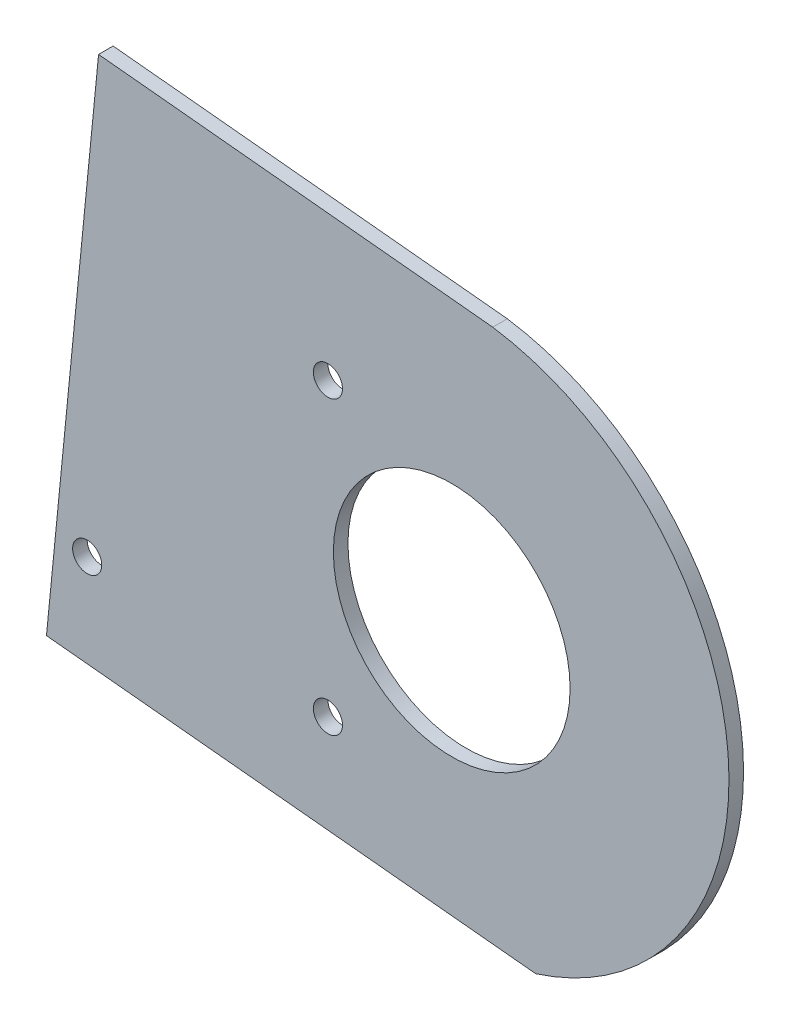
ISO-10303-21;
HEADER;
FILE_DESCRIPTION(('STEP AP214'),'2;1');
FILE_NAME('part.step','',(''),(''),'','','');
FILE_SCHEMA(('AUTOMOTIVE_DESIGN { 1 0 10303 214 1 1 1 1 }'));
ENDSEC;
DATA;
#1=APPLICATION_CONTEXT('core data for automotive mechanical design processes');
#2=APPLICATION_PROTOCOL_DEFINITION('international standard','automotive_design',2000,#1);
#3=PRODUCT_CONTEXT('',#1,'mechanical');
#4=PRODUCT('Part','Part','',(#3));
#5=PRODUCT_RELATED_PRODUCT_CATEGORY('part','',(#4));
#6=PRODUCT_DEFINITION_FORMATION('','',#4);
#7=PRODUCT_DEFINITION_CONTEXT('part definition',#1,'design');
#8=PRODUCT_DEFINITION('design','',#6,#7);
#9=PRODUCT_DEFINITION_SHAPE('','',#8);
#10=(LENGTH_UNIT() NAMED_UNIT(*) SI_UNIT(.MILLI.,.METRE.));
#11=(NAMED_UNIT(*) PLANE_ANGLE_UNIT() SI_UNIT($,.RADIAN.));
#12=(NAMED_UNIT(*) SI_UNIT($,.STERADIAN.) SOLID_ANGLE_UNIT());
#13=UNCERTAINTY_MEASURE_WITH_UNIT(LENGTH_MEASURE(1.E-05),#10,'distance_accuracy_value','');
#14=(GEOMETRIC_REPRESENTATION_CONTEXT(3) GLOBAL_UNCERTAINTY_ASSIGNED_CONTEXT((#13)) GLOBAL_UNIT_ASSIGNED_CONTEXT((#10,
#11,#12)) REPRESENTATION_CONTEXT('',''));
#15=CARTESIAN_POINT('',(0.,0.,0.));
#16=DIRECTION('',(0.,0.,1.));
#17=DIRECTION('',(1.,0.,0.));
#18=AXIS2_PLACEMENT_3D('',#15,#16,#17);
#19=CARTESIAN_POINT('',(2.28424296194058,22.9997162428038,-5.05));
#20=DIRECTION('',(-0.0988299186258703,-0.99510433984804,0.));
#21=DIRECTION('',(0.99510433984804,-0.0988299186258703,0.));
#22=AXIS2_PLACEMENT_3D('',#19,#20,#21);
#23=PLANE('',#22);
#24=DIRECTION('',(0.99510433984804,-0.0988299186258703,0.));
#25=VECTOR('',#24,1.);
#26=CARTESIAN_POINT('',(2.28424296194058,22.9997162428038,-4.25));
#27=LINE('',#26,#25);
#28=CARTESIAN_POINT('',(60.6058098649338,17.2074435329529,-4.25));
#29=VERTEX_POINT('',#28);
#30=CARTESIAN_POINT('',(82.2512300762577,15.0577040207781,-4.25));
#31=VERTEX_POINT('',#30);
#32=EDGE_CURVE('E114',#29,#31,#27,.T.);
#33=ORIENTED_EDGE('',*,*,#32,.T.);
#34=DIRECTION('',(0.,0.,1.));
#35=VECTOR('',#34,1.);
#36=CARTESIAN_POINT('',(82.2512300762577,15.0577040207781,-5.05));
#37=LINE('',#36,#35);
#38=CARTESIAN_POINT('',(82.2512300762577,15.0577040207781,-5.05));
#39=VERTEX_POINT('',#38);
#40=EDGE_CURVE('E11',#39,#31,#37,.T.);
#41=ORIENTED_EDGE('',*,*,#40,.F.);
#42=DIRECTION('',(0.99510433984804,-0.0988299186258703,0.));
#43=VECTOR('',#42,1.);
#44=CARTESIAN_POINT('',(2.28424296194058,22.9997162428038,-5.05));
#45=LINE('',#44,#43);
#46=CARTESIAN_POINT('',(60.6058098649338,17.2074435329529,-5.05));
#47=VERTEX_POINT('',#46);
#48=EDGE_CURVE('E90',#47,#39,#45,.T.);
#49=ORIENTED_EDGE('',*,*,#48,.F.);
#50=DIRECTION('',(0.,0.,1.));
#51=VECTOR('',#50,1.);
#52=CARTESIAN_POINT('',(60.6058098649338,17.2074435329529,-5.05));
#53=LINE('',#52,#51);
#54=EDGE_CURVE('E98',#47,#29,#53,.T.);
#55=ORIENTED_EDGE('',*,*,#54,.T.);
#56=EDGE_LOOP('',(#33,#41,#49,#55));
#57=FACE_BOUND('',#56,.T.);
#58=ADVANCED_FACE('F38',(#57),#23,.F.);
#59=CARTESIAN_POINT('',(80.,0.,-5.05));
#60=DIRECTION('',(0.,0.,1.));
#61=DIRECTION('',(1.,0.,0.));
#62=AXIS2_PLACEMENT_3D('',#59,#60,#61);
#63=CYLINDRICAL_SURFACE('',#62,15.2250611569742);
#64=CARTESIAN_POINT('',(80.,0.,-4.25));
#65=DIRECTION('',(0.,0.,-1.));
#66=DIRECTION('',(-1.,0.,0.));
#67=AXIS2_PLACEMENT_3D('',#64,#65,#66);
#68=CIRCLE('',#67,15.2250611569742);
#69=CARTESIAN_POINT('',(84.606571889701,-14.5114431625053,-4.25));
#70=VERTEX_POINT('',#69);
#71=EDGE_CURVE('E94',#31,#70,#68,.T.);
#72=ORIENTED_EDGE('',*,*,#71,.T.);
#73=DIRECTION('',(0.,0.,1.));
#74=VECTOR('',#73,1.);
#75=CARTESIAN_POINT('',(84.606571889701,-14.5114431625053,-5.05));
#76=LINE('',#75,#74);
#77=CARTESIAN_POINT('',(84.606571889701,-14.5114431625053,-5.05));
#78=VERTEX_POINT('',#77);
#79=EDGE_CURVE('E47',#78,#70,#76,.T.);
#80=ORIENTED_EDGE('',*,*,#79,.F.);
#81=CARTESIAN_POINT('',(80.,0.,-5.05));
#82=DIRECTION('',(0.,0.,-1.));
#83=DIRECTION('',(-1.,0.,0.));
#84=AXIS2_PLACEMENT_3D('',#81,#82,#83);
#85=CIRCLE('',#84,15.2250611569742);
#86=EDGE_CURVE('E85',#39,#78,#85,.T.);
#87=ORIENTED_EDGE('',*,*,#86,.F.);
#88=ORIENTED_EDGE('',*,*,#40,.T.);
#89=EDGE_LOOP('',(#72,#80,#87,#88));
#90=FACE_BOUND('',#89,.T.);
#91=ADVANCED_FACE('F93',(#90),#63,.T.);
#92=CARTESIAN_POINT('',(-0.602802532965987,-6.12387842505806,-5.05));
#93=DIRECTION('',(0.097961315652328,0.995190223342083,0.));
#94=DIRECTION('',(-0.995190223342083,0.097961315652328,0.));
#95=AXIS2_PLACEMENT_3D('',#92,#93,#94);
#96=PLANE('',#95);
#97=DIRECTION('',(-0.995190223342083,0.097961315652328,0.));
#98=VECTOR('',#97,1.);
#99=CARTESIAN_POINT('',(-0.602802532965987,-6.12387842505806,-4.25));
#100=LINE('',#99,#98);
#101=CARTESIAN_POINT('',(57.743852423522,-11.8672176876317,-4.25));
#102=VERTEX_POINT('',#101);
#103=EDGE_CURVE('E72',#70,#102,#100,.T.);
#104=ORIENTED_EDGE('',*,*,#103,.T.);
#105=DIRECTION('',(0.,0.,1.));
#106=VECTOR('',#105,1.);
#107=CARTESIAN_POINT('',(57.743852423522,-11.8672176876317,-5.05));
#108=LINE('',#107,#106);
#109=CARTESIAN_POINT('',(57.743852423522,-11.8672176876317,-5.05));
#110=VERTEX_POINT('',#109);
#111=EDGE_CURVE('E95',#110,#102,#108,.T.);
#112=ORIENTED_EDGE('',*,*,#111,.F.);
#113=DIRECTION('',(-0.995190223342083,0.097961315652328,0.));
#114=VECTOR('',#113,1.);
#115=CARTESIAN_POINT('',(-0.602802532965987,-6.12387842505806,-5.05));
#116=LINE('',#115,#114);
#117=EDGE_CURVE('E88',#78,#110,#116,.T.);
#118=ORIENTED_EDGE('',*,*,#117,.F.);
#119=ORIENTED_EDGE('',*,*,#79,.T.);
#120=EDGE_LOOP('',(#104,#112,#118,#119));
#121=FACE_BOUND('',#120,.T.);
#122=ADVANCED_FACE('F96',(#121),#96,.F.);
#123=CARTESIAN_POINT('',(73.2,-8.,-5.05));
#124=DIRECTION('',(0.,0.,1.));
#125=DIRECTION('',(1.,0.,0.));
#126=AXIS2_PLACEMENT_3D('',#123,#124,#125);
#127=CYLINDRICAL_SURFACE('',#126,0.799999999999995);
#128=CARTESIAN_POINT('',(73.2,-8.,-5.05));
#129=DIRECTION('',(0.,0.,-1.));
#130=DIRECTION('',(-1.,0.,0.));
#131=AXIS2_PLACEMENT_3D('',#128,#129,#130);
#132=CIRCLE('',#131,0.799999999999995);
#133=CARTESIAN_POINT('',(72.4,-8.,-5.05));
#134=VERTEX_POINT('',#133);
#135=EDGE_CURVE('E127',#134,#134,#132,.F.);
#136=ORIENTED_EDGE('',*,*,#135,.F.);
#137=EDGE_LOOP('',(#136));
#138=FACE_BOUND('',#137,.T.);
#139=CARTESIAN_POINT('',(73.2,-8.,-4.25));
#140=DIRECTION('',(0.,0.,-1.));
#141=DIRECTION('',(-1.,0.,0.));
#142=AXIS2_PLACEMENT_3D('',#139,#140,#141);
#143=CIRCLE('',#142,0.799999999999995);
#144=CARTESIAN_POINT('',(72.4,-8.,-4.25));
#145=VERTEX_POINT('',#144);
#146=EDGE_CURVE('E111',#145,#145,#143,.F.);
#147=ORIENTED_EDGE('',*,*,#146,.T.);
#148=EDGE_LOOP('',(#147));
#149=FACE_BOUND('',#148,.T.);
#150=ADVANCED_FACE('F156',(#138,#149),#127,.F.);
#151=CARTESIAN_POINT('',(73.2,8.,-5.05));
#152=DIRECTION('',(0.,0.,1.));
#153=DIRECTION('',(1.,0.,0.));
#154=AXIS2_PLACEMENT_3D('',#151,#152,#153);
#155=CYLINDRICAL_SURFACE('',#154,0.799999999999995);
#156=CARTESIAN_POINT('',(73.2,8.,-5.05));
#157=DIRECTION('',(0.,0.,-1.));
#158=DIRECTION('',(-1.,0.,0.));
#159=AXIS2_PLACEMENT_3D('',#156,#157,#158);
#160=CIRCLE('',#159,0.799999999999995);
#161=CARTESIAN_POINT('',(72.4,8.,-5.05));
#162=VERTEX_POINT('',#161);
#163=EDGE_CURVE('E129',#162,#162,#160,.F.);
#164=ORIENTED_EDGE('',*,*,#163,.F.);
#165=EDGE_LOOP('',(#164));
#166=FACE_BOUND('',#165,.T.);
#167=CARTESIAN_POINT('',(73.2,8.,-4.25));
#168=DIRECTION('',(0.,0.,-1.));
#169=DIRECTION('',(-1.,0.,0.));
#170=AXIS2_PLACEMENT_3D('',#167,#168,#169);
#171=CIRCLE('',#170,0.799999999999995);
#172=CARTESIAN_POINT('',(72.4,8.,-4.25));
#173=VERTEX_POINT('',#172);
#174=EDGE_CURVE('E108',#173,#173,#171,.F.);
#175=ORIENTED_EDGE('',*,*,#174,.T.);
#176=EDGE_LOOP('',(#175));
#177=FACE_BOUND('',#176,.T.);
#178=ADVANCED_FACE('F158',(#166,#177),#155,.F.);
#179=CARTESIAN_POINT('',(80.,0.,-5.05));
#180=DIRECTION('',(0.,0.,1.));
#181=DIRECTION('',(1.,0.,0.));
#182=AXIS2_PLACEMENT_3D('',#179,#180,#181);
#183=CYLINDRICAL_SURFACE('',#182,6.5);
#184=CARTESIAN_POINT('',(80.,0.,-5.05));
#185=DIRECTION('',(0.,0.,-1.));
#186=DIRECTION('',(-1.,0.,0.));
#187=AXIS2_PLACEMENT_3D('',#184,#185,#186);
#188=CIRCLE('',#187,6.5);
#189=CARTESIAN_POINT('',(73.5,0.,-5.05));
#190=VERTEX_POINT('',#189);
#191=EDGE_CURVE('E134',#190,#190,#188,.F.);
#192=ORIENTED_EDGE('',*,*,#191,.F.);
#193=EDGE_LOOP('',(#192));
#194=FACE_BOUND('',#193,.T.);
#195=CARTESIAN_POINT('',(80.,0.,-4.25));
#196=DIRECTION('',(0.,0.,-1.));
#197=DIRECTION('',(-1.,0.,0.));
#198=AXIS2_PLACEMENT_3D('',#195,#196,#197);
#199=CIRCLE('',#198,6.5);
#200=CARTESIAN_POINT('',(73.5,0.,-4.25));
#201=VERTEX_POINT('',#200);
#202=EDGE_CURVE('E105',#201,#201,#199,.F.);
#203=ORIENTED_EDGE('',*,*,#202,.T.);
#204=EDGE_LOOP('',(#203));
#205=FACE_BOUND('',#204,.T.);
#206=ADVANCED_FACE('F144',(#194,#205),#183,.F.);
#207=CARTESIAN_POINT('',(59.98,-7.,-5.05));
#208=DIRECTION('',(0.,0.,1.));
#209=DIRECTION('',(1.,0.,0.));
#210=AXIS2_PLACEMENT_3D('',#207,#208,#209);
#211=CYLINDRICAL_SURFACE('',#210,0.800000000000002);
#212=CARTESIAN_POINT('',(59.98,-7.,-5.05));
#213=DIRECTION('',(0.,0.,-1.));
#214=DIRECTION('',(-1.,0.,0.));
#215=AXIS2_PLACEMENT_3D('',#212,#213,#214);
#216=CIRCLE('',#215,0.800000000000002);
#217=CARTESIAN_POINT('',(59.18,-7.,-5.05));
#218=VERTEX_POINT('',#217);
#219=EDGE_CURVE('E120',#218,#218,#216,.F.);
#220=ORIENTED_EDGE('',*,*,#219,.F.);
#221=EDGE_LOOP('',(#220));
#222=FACE_BOUND('',#221,.T.);
#223=CARTESIAN_POINT('',(59.98,-7.,-4.25));
#224=DIRECTION('',(0.,0.,-1.));
#225=DIRECTION('',(-1.,0.,0.));
#226=AXIS2_PLACEMENT_3D('',#223,#224,#225);
#227=CIRCLE('',#226,0.800000000000002);
#228=CARTESIAN_POINT('',(59.18,-7.,-4.25));
#229=VERTEX_POINT('',#228);
#230=EDGE_CURVE('E102',#229,#229,#227,.F.);
#231=ORIENTED_EDGE('',*,*,#230,.T.);
#232=EDGE_LOOP('',(#231));
#233=FACE_BOUND('',#232,.T.);
#234=ADVANCED_FACE('F40',(#222,#233),#211,.F.);
#235=CARTESIAN_POINT('',(58.3466549564879,-5.74333926257359,-5.05));
#236=DIRECTION('',(0.995190223342083,-0.0979613156523277,0.));
#237=DIRECTION('',(0.0979613156523277,0.995190223342083,0.));
#238=AXIS2_PLACEMENT_3D('',#235,#236,#237);
#239=PLANE('',#238);
#240=DIRECTION('',(0.0979613156523277,0.995190223342083,0.));
#241=VECTOR('',#240,1.);
#242=CARTESIAN_POINT('',(58.3466549564879,-5.74333926257359,-4.25));
#243=LINE('',#242,#241);
#244=EDGE_CURVE('E78',#102,#29,#243,.T.);
#245=ORIENTED_EDGE('',*,*,#244,.T.);
#246=ORIENTED_EDGE('',*,*,#54,.F.);
#247=DIRECTION('',(0.0979613156523277,0.995190223342083,0.));
#248=VECTOR('',#247,1.);
#249=CARTESIAN_POINT('',(58.3466549564879,-5.74333926257359,-5.05));
#250=LINE('',#249,#248);
#251=EDGE_CURVE('E55',#110,#47,#250,.T.);
#252=ORIENTED_EDGE('',*,*,#251,.F.);
#253=ORIENTED_EDGE('',*,*,#111,.T.);
#254=EDGE_LOOP('',(#245,#246,#252,#253));
#255=FACE_BOUND('',#254,.T.);
#256=ADVANCED_FACE('F122',(#255),#239,.F.);
#257=CARTESIAN_POINT('',(0.,0.,-5.05));
#258=DIRECTION('',(0.,0.,-1.));
#259=DIRECTION('',(-1.,0.,0.));
#260=AXIS2_PLACEMENT_3D('',#257,#258,#259);
#261=PLANE('',#260);
#262=ORIENTED_EDGE('',*,*,#219,.T.);
#263=EDGE_LOOP('',(#262));
#264=FACE_BOUND('',#263,.T.);
#265=ORIENTED_EDGE('',*,*,#191,.T.);
#266=EDGE_LOOP('',(#265));
#267=FACE_BOUND('',#266,.T.);
#268=ORIENTED_EDGE('',*,*,#163,.T.);
#269=EDGE_LOOP('',(#268));
#270=FACE_BOUND('',#269,.T.);
#271=ORIENTED_EDGE('',*,*,#135,.T.);
#272=EDGE_LOOP('',(#271));
#273=FACE_BOUND('',#272,.T.);
#274=ORIENTED_EDGE('',*,*,#48,.T.);
#275=ORIENTED_EDGE('',*,*,#86,.T.);
#276=ORIENTED_EDGE('',*,*,#117,.T.);
#277=ORIENTED_EDGE('',*,*,#251,.T.);
#278=EDGE_LOOP('',(#274,#275,#276,#277));
#279=FACE_BOUND('',#278,.T.);
#280=ADVANCED_FACE('F86',(#264,#267,#270,#273,#279),#261,.T.);
#281=CARTESIAN_POINT('',(0.,0.,-4.25));
#282=DIRECTION('',(0.,0.,-1.));
#283=DIRECTION('',(-1.,0.,0.));
#284=AXIS2_PLACEMENT_3D('',#281,#282,#283);
#285=PLANE('',#284);
#286=ORIENTED_EDGE('',*,*,#230,.F.);
#287=EDGE_LOOP('',(#286));
#288=FACE_BOUND('',#287,.T.);
#289=ORIENTED_EDGE('',*,*,#202,.F.);
#290=EDGE_LOOP('',(#289));
#291=FACE_BOUND('',#290,.T.);
#292=ORIENTED_EDGE('',*,*,#174,.F.);
#293=EDGE_LOOP('',(#292));
#294=FACE_BOUND('',#293,.T.);
#295=ORIENTED_EDGE('',*,*,#146,.F.);
#296=EDGE_LOOP('',(#295));
#297=FACE_BOUND('',#296,.T.);
#298=ORIENTED_EDGE('',*,*,#32,.F.);
#299=ORIENTED_EDGE('',*,*,#244,.F.);
#300=ORIENTED_EDGE('',*,*,#103,.F.);
#301=ORIENTED_EDGE('',*,*,#71,.F.);
#302=EDGE_LOOP('',(#298,#299,#300,#301));
#303=FACE_BOUND('',#302,.T.);
#304=ADVANCED_FACE('F125',(#288,#291,#294,#297,#303),#285,.F.);
#305=CLOSED_SHELL('',(#58,#91,#122,#150,#178,#206,#234,#256,#280,#304));
#306=MANIFOLD_SOLID_BREP('B2',#305);
#307=ADVANCED_BREP_SHAPE_REPRESENTATION('',(#18,#306),#14);
#308=SHAPE_DEFINITION_REPRESENTATION(#9,#307);
ENDSEC;
END-ISO-10303-21;
